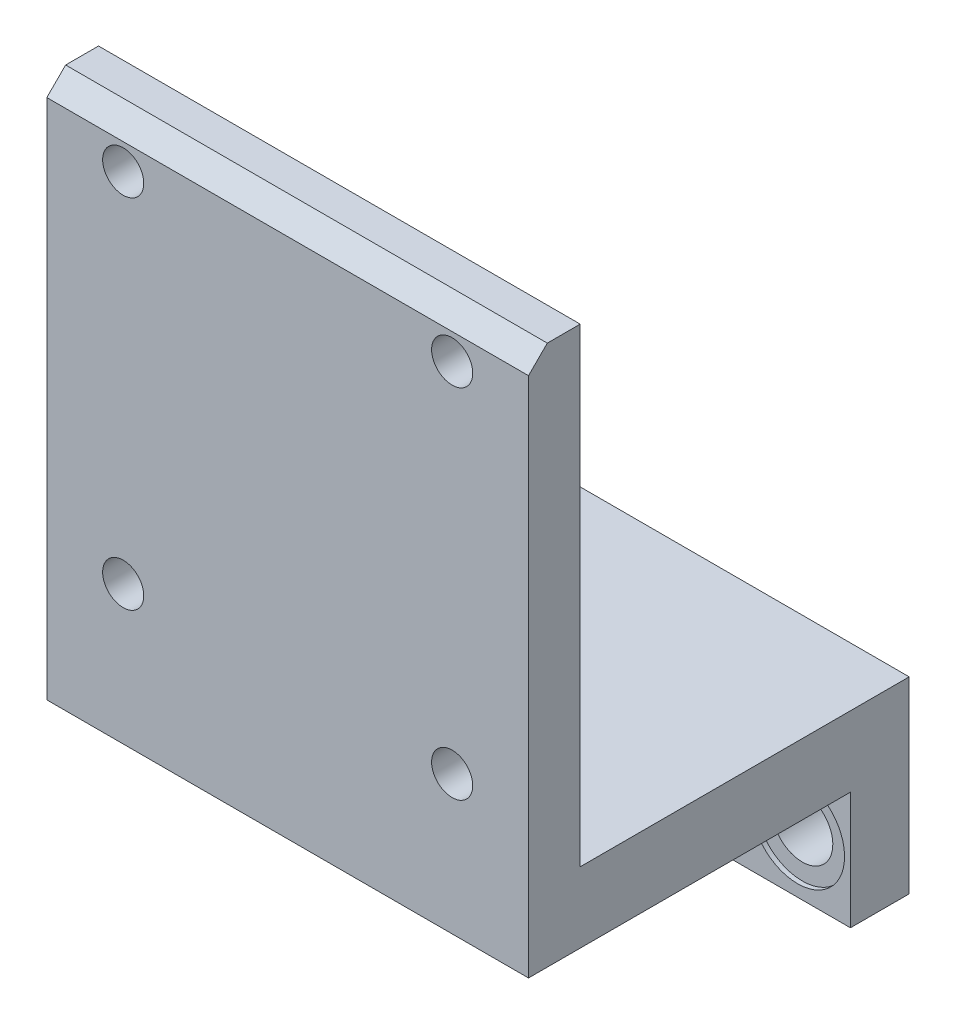
ISO-10303-21;
HEADER;
FILE_DESCRIPTION(('STEP AP214'),'2;1');
FILE_NAME('part.step','',(''),(''),'','','');
FILE_SCHEMA(('AUTOMOTIVE_DESIGN { 1 0 10303 214 1 1 1 1 }'));
ENDSEC;
DATA;
#1=APPLICATION_CONTEXT('core data for automotive mechanical design processes');
#2=APPLICATION_PROTOCOL_DEFINITION('international standard','automotive_design',2000,#1);
#3=PRODUCT_CONTEXT('',#1,'mechanical');
#4=PRODUCT('Part','Part','',(#3));
#5=PRODUCT_RELATED_PRODUCT_CATEGORY('part','',(#4));
#6=PRODUCT_DEFINITION_FORMATION('','',#4);
#7=PRODUCT_DEFINITION_CONTEXT('part definition',#1,'design');
#8=PRODUCT_DEFINITION('design','',#6,#7);
#9=PRODUCT_DEFINITION_SHAPE('','',#8);
#10=(LENGTH_UNIT() NAMED_UNIT(*) SI_UNIT(.MILLI.,.METRE.));
#11=(NAMED_UNIT(*) PLANE_ANGLE_UNIT() SI_UNIT($,.RADIAN.));
#12=(NAMED_UNIT(*) SI_UNIT($,.STERADIAN.) SOLID_ANGLE_UNIT());
#13=UNCERTAINTY_MEASURE_WITH_UNIT(LENGTH_MEASURE(1.E-05),#10,'distance_accuracy_value','');
#14=(GEOMETRIC_REPRESENTATION_CONTEXT(3) GLOBAL_UNCERTAINTY_ASSIGNED_CONTEXT((#13)) GLOBAL_UNIT_ASSIGNED_CONTEXT((#10,
#11,#12)) REPRESENTATION_CONTEXT('',''));
#15=CARTESIAN_POINT('',(0.,0.,0.));
#16=DIRECTION('',(0.,0.,1.));
#17=DIRECTION('',(1.,0.,0.));
#18=AXIS2_PLACEMENT_3D('',#15,#16,#17);
#19=CARTESIAN_POINT('',(205.,230.,0.));
#20=DIRECTION('',(0.,0.,-1.));
#21=DIRECTION('',(0.,1.,0.));
#22=AXIS2_PLACEMENT_3D('',#19,#20,#21);
#23=PLANE('',#22);
#24=CARTESIAN_POINT('',(172.5,59.,0.));
#25=DIRECTION('',(0.,0.,1.));
#26=DIRECTION('',(0.,-1.,0.));
#27=AXIS2_PLACEMENT_3D('',#24,#25,#26);
#28=CIRCLE('',#27,8.74999999999998);
#29=CARTESIAN_POINT('',(172.5,50.25,0.));
#30=VERTEX_POINT('',#29);
#31=EDGE_CURVE('E196',#30,#30,#28,.T.);
#32=ORIENTED_EDGE('',*,*,#31,.F.);
#33=EDGE_LOOP('',(#32));
#34=FACE_BOUND('',#33,.T.);
#35=CARTESIAN_POINT('',(172.5,211.,0.));
#36=DIRECTION('',(0.,0.,1.));
#37=DIRECTION('',(0.,-1.,0.));
#38=AXIS2_PLACEMENT_3D('',#35,#36,#37);
#39=CIRCLE('',#38,8.74999999999998);
#40=CARTESIAN_POINT('',(172.5,202.25,0.));
#41=VERTEX_POINT('',#40);
#42=EDGE_CURVE('E190',#41,#41,#39,.T.);
#43=ORIENTED_EDGE('',*,*,#42,.F.);
#44=EDGE_LOOP('',(#43));
#45=FACE_BOUND('',#44,.T.);
#46=CARTESIAN_POINT('',(32.5,59.,0.));
#47=DIRECTION('',(0.,0.,1.));
#48=DIRECTION('',(0.,-1.,0.));
#49=AXIS2_PLACEMENT_3D('',#46,#47,#48);
#50=CIRCLE('',#49,8.74999999999999);
#51=CARTESIAN_POINT('',(32.5,50.25,0.));
#52=VERTEX_POINT('',#51);
#53=EDGE_CURVE('E184',#52,#52,#50,.T.);
#54=ORIENTED_EDGE('',*,*,#53,.F.);
#55=EDGE_LOOP('',(#54));
#56=FACE_BOUND('',#55,.T.);
#57=CARTESIAN_POINT('',(32.5,211.,0.));
#58=DIRECTION('',(0.,0.,1.));
#59=DIRECTION('',(0.,-1.,0.));
#60=AXIS2_PLACEMENT_3D('',#57,#58,#59);
#61=CIRCLE('',#60,8.74999999999999);
#62=CARTESIAN_POINT('',(32.5,202.25,0.));
#63=VERTEX_POINT('',#62);
#64=EDGE_CURVE('E178',#63,#63,#61,.T.);
#65=ORIENTED_EDGE('',*,*,#64,.F.);
#66=EDGE_LOOP('',(#65));
#67=FACE_BOUND('',#66,.T.);
#68=DIRECTION('',(0.,-1.,0.));
#69=VECTOR('',#68,1.);
#70=CARTESIAN_POINT('',(205.,230.,0.));
#71=LINE('',#70,#69);
#72=CARTESIAN_POINT('',(205.,222.,0.));
#73=VERTEX_POINT('',#72);
#74=CARTESIAN_POINT('',(205.,0.,0.));
#75=VERTEX_POINT('',#74);
#76=EDGE_CURVE('E106',#73,#75,#71,.T.);
#77=ORIENTED_EDGE('',*,*,#76,.F.);
#78=DIRECTION('',(-1.,0.,0.));
#79=VECTOR('',#78,1.);
#80=CARTESIAN_POINT('',(205.,222.,0.));
#81=LINE('',#80,#79);
#82=CARTESIAN_POINT('',(0.,222.,0.));
#83=VERTEX_POINT('',#82);
#84=EDGE_CURVE('E129',#73,#83,#81,.T.);
#85=ORIENTED_EDGE('',*,*,#84,.T.);
#86=DIRECTION('',(0.,-1.,0.));
#87=VECTOR('',#86,1.);
#88=CARTESIAN_POINT('',(0.,230.,0.));
#89=LINE('',#88,#87);
#90=CARTESIAN_POINT('',(0.,0.,0.));
#91=VERTEX_POINT('',#90);
#92=EDGE_CURVE('E127',#83,#91,#89,.T.);
#93=ORIENTED_EDGE('',*,*,#92,.T.);
#94=DIRECTION('',(-1.,0.,0.));
#95=VECTOR('',#94,1.);
#96=CARTESIAN_POINT('',(205.,0.,0.));
#97=LINE('',#96,#95);
#98=EDGE_CURVE('E121',#75,#91,#97,.T.);
#99=ORIENTED_EDGE('',*,*,#98,.F.);
#100=EDGE_LOOP('',(#77,#85,#93,#99));
#101=FACE_BOUND('',#100,.T.);
#102=ADVANCED_FACE('F36',(#34,#45,#56,#67,#101),#23,.F.);
#103=CARTESIAN_POINT('',(205.,0.,0.));
#104=DIRECTION('',(0.,1.,0.));
#105=DIRECTION('',(0.,0.,1.));
#106=AXIS2_PLACEMENT_3D('',#103,#104,#105);
#107=PLANE('',#106);
#108=DIRECTION('',(0.,0.,-1.));
#109=VECTOR('',#108,1.);
#110=CARTESIAN_POINT('',(0.,0.,0.));
#111=LINE('',#110,#109);
#112=CARTESIAN_POINT('',(0.,0.,-137.));
#113=VERTEX_POINT('',#112);
#114=EDGE_CURVE('E162',#91,#113,#111,.T.);
#115=ORIENTED_EDGE('',*,*,#114,.T.);
#116=DIRECTION('',(-1.,0.,0.));
#117=VECTOR('',#116,1.);
#118=CARTESIAN_POINT('',(205.,0.,-137.));
#119=LINE('',#118,#117);
#120=CARTESIAN_POINT('',(205.,0.,-137.));
#121=VERTEX_POINT('',#120);
#122=EDGE_CURVE('E123',#121,#113,#119,.T.);
#123=ORIENTED_EDGE('',*,*,#122,.F.);
#124=DIRECTION('',(0.,0.,-1.));
#125=VECTOR('',#124,1.);
#126=CARTESIAN_POINT('',(205.,0.,0.));
#127=LINE('',#126,#125);
#128=EDGE_CURVE('E109',#75,#121,#127,.T.);
#129=ORIENTED_EDGE('',*,*,#128,.F.);
#130=ORIENTED_EDGE('',*,*,#98,.T.);
#131=EDGE_LOOP('',(#115,#123,#129,#130));
#132=FACE_BOUND('',#131,.T.);
#133=ADVANCED_FACE('F120',(#132),#107,.F.);
#134=CARTESIAN_POINT('',(205.,0.,-137.));
#135=DIRECTION('',(0.,0.,-1.));
#136=DIRECTION('',(0.,1.,0.));
#137=AXIS2_PLACEMENT_3D('',#134,#135,#136);
#138=PLANE('',#137);
#139=CARTESIAN_POINT('',(182.5,-25.,-137.));
#140=DIRECTION('',(0.,0.,1.));
#141=DIRECTION('',(0.,-1.,0.));
#142=AXIS2_PLACEMENT_3D('',#139,#140,#141);
#143=CIRCLE('',#142,20.);
#144=CARTESIAN_POINT('',(182.5,-45.,-137.));
#145=VERTEX_POINT('',#144);
#146=EDGE_CURVE('E232',#145,#145,#143,.T.);
#147=ORIENTED_EDGE('',*,*,#146,.F.);
#148=EDGE_LOOP('',(#147));
#149=FACE_BOUND('',#148,.T.);
#150=CARTESIAN_POINT('',(102.5,-25.,-137.));
#151=DIRECTION('',(0.,0.,1.));
#152=DIRECTION('',(0.,-1.,0.));
#153=AXIS2_PLACEMENT_3D('',#150,#151,#152);
#154=CIRCLE('',#153,20.);
#155=CARTESIAN_POINT('',(102.5,-45.,-137.));
#156=VERTEX_POINT('',#155);
#157=EDGE_CURVE('E220',#156,#156,#154,.T.);
#158=ORIENTED_EDGE('',*,*,#157,.F.);
#159=EDGE_LOOP('',(#158));
#160=FACE_BOUND('',#159,.T.);
#161=CARTESIAN_POINT('',(22.5,-25.,-137.));
#162=DIRECTION('',(0.,0.,1.));
#163=DIRECTION('',(0.,-1.,0.));
#164=AXIS2_PLACEMENT_3D('',#161,#162,#163);
#165=CIRCLE('',#164,20.);
#166=CARTESIAN_POINT('',(22.5,-45.,-137.));
#167=VERTEX_POINT('',#166);
#168=EDGE_CURVE('E208',#167,#167,#165,.T.);
#169=ORIENTED_EDGE('',*,*,#168,.F.);
#170=EDGE_LOOP('',(#169));
#171=FACE_BOUND('',#170,.T.);
#172=DIRECTION('',(0.,-1.,0.));
#173=VECTOR('',#172,1.);
#174=CARTESIAN_POINT('',(0.,0.,-137.));
#175=LINE('',#174,#173);
#176=CARTESIAN_POINT('',(0.,-50.,-137.));
#177=VERTEX_POINT('',#176);
#178=EDGE_CURVE('E160',#113,#177,#175,.T.);
#179=ORIENTED_EDGE('',*,*,#178,.T.);
#180=DIRECTION('',(-1.,0.,0.));
#181=VECTOR('',#180,1.);
#182=CARTESIAN_POINT('',(205.,-50.,-137.));
#183=LINE('',#182,#181);
#184=CARTESIAN_POINT('',(205.,-50.,-137.));
#185=VERTEX_POINT('',#184);
#186=EDGE_CURVE('E132',#185,#177,#183,.T.);
#187=ORIENTED_EDGE('',*,*,#186,.F.);
#188=DIRECTION('',(0.,-1.,0.));
#189=VECTOR('',#188,1.);
#190=CARTESIAN_POINT('',(205.,0.,-137.));
#191=LINE('',#190,#189);
#192=EDGE_CURVE('E125',#121,#185,#191,.T.);
#193=ORIENTED_EDGE('',*,*,#192,.F.);
#194=ORIENTED_EDGE('',*,*,#122,.T.);
#195=EDGE_LOOP('',(#179,#187,#193,#194));
#196=FACE_BOUND('',#195,.T.);
#197=ADVANCED_FACE('F238',(#149,#160,#171,#196),#138,.F.);
#198=CARTESIAN_POINT('',(205.,-50.,-137.));
#199=DIRECTION('',(0.,1.,0.));
#200=DIRECTION('',(0.,0.,1.));
#201=AXIS2_PLACEMENT_3D('',#198,#199,#200);
#202=PLANE('',#201);
#203=DIRECTION('',(0.,0.,-1.));
#204=VECTOR('',#203,1.);
#205=CARTESIAN_POINT('',(0.,-50.,-137.));
#206=LINE('',#205,#204);
#207=CARTESIAN_POINT('',(0.,-50.,-162.));
#208=VERTEX_POINT('',#207);
#209=EDGE_CURVE('E158',#177,#208,#206,.T.);
#210=ORIENTED_EDGE('',*,*,#209,.T.);
#211=DIRECTION('',(-1.,0.,0.));
#212=VECTOR('',#211,1.);
#213=CARTESIAN_POINT('',(205.,-50.,-162.));
#214=LINE('',#213,#212);
#215=CARTESIAN_POINT('',(205.,-50.,-162.));
#216=VERTEX_POINT('',#215);
#217=EDGE_CURVE('E138',#216,#208,#214,.T.);
#218=ORIENTED_EDGE('',*,*,#217,.F.);
#219=DIRECTION('',(0.,0.,-1.));
#220=VECTOR('',#219,1.);
#221=CARTESIAN_POINT('',(205.,-50.,-137.));
#222=LINE('',#221,#220);
#223=EDGE_CURVE('E173',#185,#216,#222,.T.);
#224=ORIENTED_EDGE('',*,*,#223,.F.);
#225=ORIENTED_EDGE('',*,*,#186,.T.);
#226=EDGE_LOOP('',(#210,#218,#224,#225));
#227=FACE_BOUND('',#226,.T.);
#228=ADVANCED_FACE('F241',(#227),#202,.F.);
#229=CARTESIAN_POINT('',(205.,-50.,-162.));
#230=DIRECTION('',(0.,0.,1.));
#231=DIRECTION('',(1.,0.,0.));
#232=AXIS2_PLACEMENT_3D('',#229,#230,#231);
#233=PLANE('',#232);
#234=CARTESIAN_POINT('',(182.5,-25.,-162.));
#235=DIRECTION('',(0.,0.,1.));
#236=DIRECTION('',(1.,0.,0.));
#237=AXIS2_PLACEMENT_3D('',#234,#235,#236);
#238=CIRCLE('',#237,13.);
#239=CARTESIAN_POINT('',(195.5,-25.,-162.));
#240=VERTEX_POINT('',#239);
#241=EDGE_CURVE('E223',#240,#240,#238,.T.);
#242=ORIENTED_EDGE('',*,*,#241,.T.);
#243=EDGE_LOOP('',(#242));
#244=FACE_BOUND('',#243,.T.);
#245=CARTESIAN_POINT('',(102.5,-25.,-162.));
#246=DIRECTION('',(0.,0.,1.));
#247=DIRECTION('',(1.,0.,0.));
#248=AXIS2_PLACEMENT_3D('',#245,#246,#247);
#249=CIRCLE('',#248,13.);
#250=CARTESIAN_POINT('',(115.5,-25.,-162.));
#251=VERTEX_POINT('',#250);
#252=EDGE_CURVE('E211',#251,#251,#249,.T.);
#253=ORIENTED_EDGE('',*,*,#252,.T.);
#254=EDGE_LOOP('',(#253));
#255=FACE_BOUND('',#254,.T.);
#256=CARTESIAN_POINT('',(22.5,-25.,-162.));
#257=DIRECTION('',(0.,0.,1.));
#258=DIRECTION('',(1.,0.,0.));
#259=AXIS2_PLACEMENT_3D('',#256,#257,#258);
#260=CIRCLE('',#259,13.);
#261=CARTESIAN_POINT('',(35.5,-25.,-162.));
#262=VERTEX_POINT('',#261);
#263=EDGE_CURVE('E199',#262,#262,#260,.T.);
#264=ORIENTED_EDGE('',*,*,#263,.T.);
#265=EDGE_LOOP('',(#264));
#266=FACE_BOUND('',#265,.T.);
#267=DIRECTION('',(0.,1.,0.));
#268=VECTOR('',#267,1.);
#269=CARTESIAN_POINT('',(0.,-50.,-162.));
#270=LINE('',#269,#268);
#271=CARTESIAN_POINT('',(0.,30.,-162.));
#272=VERTEX_POINT('',#271);
#273=EDGE_CURVE('E156',#208,#272,#270,.T.);
#274=ORIENTED_EDGE('',*,*,#273,.T.);
#275=DIRECTION('',(-1.,0.,0.));
#276=VECTOR('',#275,1.);
#277=CARTESIAN_POINT('',(205.,30.,-162.));
#278=LINE('',#277,#276);
#279=CARTESIAN_POINT('',(205.,30.,-162.));
#280=VERTEX_POINT('',#279);
#281=EDGE_CURVE('E141',#280,#272,#278,.T.);
#282=ORIENTED_EDGE('',*,*,#281,.F.);
#283=DIRECTION('',(0.,1.,0.));
#284=VECTOR('',#283,1.);
#285=CARTESIAN_POINT('',(205.,-50.,-162.));
#286=LINE('',#285,#284);
#287=EDGE_CURVE('E171',#216,#280,#286,.T.);
#288=ORIENTED_EDGE('',*,*,#287,.F.);
#289=ORIENTED_EDGE('',*,*,#217,.T.);
#290=EDGE_LOOP('',(#274,#282,#288,#289));
#291=FACE_BOUND('',#290,.T.);
#292=ADVANCED_FACE('F259',(#244,#255,#266,#291),#233,.F.);
#293=CARTESIAN_POINT('',(205.,30.,-162.));
#294=DIRECTION('',(0.,-1.,0.));
#295=DIRECTION('',(0.,0.,-1.));
#296=AXIS2_PLACEMENT_3D('',#293,#294,#295);
#297=PLANE('',#296);
#298=DIRECTION('',(0.,0.,1.));
#299=VECTOR('',#298,1.);
#300=CARTESIAN_POINT('',(0.,30.,-162.));
#301=LINE('',#300,#299);
#302=CARTESIAN_POINT('',(0.,30.,-22.));
#303=VERTEX_POINT('',#302);
#304=EDGE_CURVE('E154',#272,#303,#301,.T.);
#305=ORIENTED_EDGE('',*,*,#304,.T.);
#306=DIRECTION('',(-1.,0.,0.));
#307=VECTOR('',#306,1.);
#308=CARTESIAN_POINT('',(205.,30.,-22.));
#309=LINE('',#308,#307);
#310=CARTESIAN_POINT('',(205.,30.,-22.));
#311=VERTEX_POINT('',#310);
#312=EDGE_CURVE('E144',#311,#303,#309,.T.);
#313=ORIENTED_EDGE('',*,*,#312,.F.);
#314=DIRECTION('',(0.,0.,1.));
#315=VECTOR('',#314,1.);
#316=CARTESIAN_POINT('',(205.,30.,-162.));
#317=LINE('',#316,#315);
#318=EDGE_CURVE('E169',#280,#311,#317,.T.);
#319=ORIENTED_EDGE('',*,*,#318,.F.);
#320=ORIENTED_EDGE('',*,*,#281,.T.);
#321=EDGE_LOOP('',(#305,#313,#319,#320));
#322=FACE_BOUND('',#321,.T.);
#323=ADVANCED_FACE('F263',(#322),#297,.F.);
#324=CARTESIAN_POINT('',(205.,30.,-22.));
#325=DIRECTION('',(0.,0.,1.));
#326=DIRECTION('',(1.,0.,0.));
#327=AXIS2_PLACEMENT_3D('',#324,#325,#326);
#328=PLANE('',#327);
#329=CARTESIAN_POINT('',(172.5,59.,-22.));
#330=DIRECTION('',(0.,0.,1.));
#331=DIRECTION('',(1.,0.,0.));
#332=AXIS2_PLACEMENT_3D('',#329,#330,#331);
#333=CIRCLE('',#332,8.74999999999999);
#334=CARTESIAN_POINT('',(181.25,59.,-22.));
#335=VERTEX_POINT('',#334);
#336=EDGE_CURVE('E193',#335,#335,#333,.T.);
#337=ORIENTED_EDGE('',*,*,#336,.T.);
#338=EDGE_LOOP('',(#337));
#339=FACE_BOUND('',#338,.T.);
#340=CARTESIAN_POINT('',(172.5,211.,-22.));
#341=DIRECTION('',(0.,0.,1.));
#342=DIRECTION('',(1.,0.,0.));
#343=AXIS2_PLACEMENT_3D('',#340,#341,#342);
#344=CIRCLE('',#343,8.74999999999999);
#345=CARTESIAN_POINT('',(181.25,211.,-22.));
#346=VERTEX_POINT('',#345);
#347=EDGE_CURVE('E187',#346,#346,#344,.T.);
#348=ORIENTED_EDGE('',*,*,#347,.T.);
#349=EDGE_LOOP('',(#348));
#350=FACE_BOUND('',#349,.T.);
#351=CARTESIAN_POINT('',(32.5,59.,-22.));
#352=DIRECTION('',(0.,0.,1.));
#353=DIRECTION('',(1.,0.,0.));
#354=AXIS2_PLACEMENT_3D('',#351,#352,#353);
#355=CIRCLE('',#354,8.74999999999999);
#356=CARTESIAN_POINT('',(41.25,59.,-22.));
#357=VERTEX_POINT('',#356);
#358=EDGE_CURVE('E181',#357,#357,#355,.T.);
#359=ORIENTED_EDGE('',*,*,#358,.T.);
#360=EDGE_LOOP('',(#359));
#361=FACE_BOUND('',#360,.T.);
#362=CARTESIAN_POINT('',(32.5,211.,-22.));
#363=DIRECTION('',(0.,0.,1.));
#364=DIRECTION('',(1.,0.,0.));
#365=AXIS2_PLACEMENT_3D('',#362,#363,#364);
#366=CIRCLE('',#365,8.74999999999999);
#367=CARTESIAN_POINT('',(41.25,211.,-22.));
#368=VERTEX_POINT('',#367);
#369=EDGE_CURVE('E165',#368,#368,#366,.T.);
#370=ORIENTED_EDGE('',*,*,#369,.T.);
#371=EDGE_LOOP('',(#370));
#372=FACE_BOUND('',#371,.T.);
#373=DIRECTION('',(0.,1.,0.));
#374=VECTOR('',#373,1.);
#375=CARTESIAN_POINT('',(0.,30.,-22.));
#376=LINE('',#375,#374);
#377=CARTESIAN_POINT('',(0.,230.,-22.));
#378=VERTEX_POINT('',#377);
#379=EDGE_CURVE('E152',#303,#378,#376,.T.);
#380=ORIENTED_EDGE('',*,*,#379,.T.);
#381=DIRECTION('',(-1.,0.,0.));
#382=VECTOR('',#381,1.);
#383=CARTESIAN_POINT('',(205.,230.,-22.));
#384=LINE('',#383,#382);
#385=CARTESIAN_POINT('',(205.,230.,-22.));
#386=VERTEX_POINT('',#385);
#387=EDGE_CURVE('E147',#386,#378,#384,.T.);
#388=ORIENTED_EDGE('',*,*,#387,.F.);
#389=DIRECTION('',(0.,1.,0.));
#390=VECTOR('',#389,1.);
#391=CARTESIAN_POINT('',(205.,30.,-22.));
#392=LINE('',#391,#390);
#393=EDGE_CURVE('E167',#311,#386,#392,.T.);
#394=ORIENTED_EDGE('',*,*,#393,.F.);
#395=ORIENTED_EDGE('',*,*,#312,.T.);
#396=EDGE_LOOP('',(#380,#388,#394,#395));
#397=FACE_BOUND('',#396,.T.);
#398=ADVANCED_FACE('F268',(#339,#350,#361,#372,#397),#328,.F.);
#399=CARTESIAN_POINT('',(205.,230.,-22.));
#400=DIRECTION('',(0.,-1.,0.));
#401=DIRECTION('',(0.,0.,-1.));
#402=AXIS2_PLACEMENT_3D('',#399,#400,#401);
#403=PLANE('',#402);
#404=DIRECTION('',(0.,0.,1.));
#405=VECTOR('',#404,1.);
#406=CARTESIAN_POINT('',(0.,230.,-22.));
#407=LINE('',#406,#405);
#408=CARTESIAN_POINT('',(0.,230.,-8.));
#409=VERTEX_POINT('',#408);
#410=EDGE_CURVE('E116',#378,#409,#407,.T.);
#411=ORIENTED_EDGE('',*,*,#410,.T.);
#412=DIRECTION('',(1.,0.,0.));
#413=VECTOR('',#412,1.);
#414=CARTESIAN_POINT('',(205.,230.,-8.));
#415=LINE('',#414,#413);
#416=CARTESIAN_POINT('',(205.,230.,-8.));
#417=VERTEX_POINT('',#416);
#418=EDGE_CURVE('E44',#409,#417,#415,.T.);
#419=ORIENTED_EDGE('',*,*,#418,.T.);
#420=DIRECTION('',(0.,0.,1.));
#421=VECTOR('',#420,1.);
#422=CARTESIAN_POINT('',(205.,230.,-22.));
#423=LINE('',#422,#421);
#424=EDGE_CURVE('E150',#386,#417,#423,.T.);
#425=ORIENTED_EDGE('',*,*,#424,.F.);
#426=ORIENTED_EDGE('',*,*,#387,.T.);
#427=EDGE_LOOP('',(#411,#419,#425,#426));
#428=FACE_BOUND('',#427,.T.);
#429=ADVANCED_FACE('F269',(#428),#403,.F.);
#430=CARTESIAN_POINT('',(205.,0.,0.));
#431=DIRECTION('',(1.,0.,0.));
#432=DIRECTION('',(0.,0.,-1.));
#433=AXIS2_PLACEMENT_3D('',#430,#431,#432);
#434=PLANE('',#433);
#435=ORIENTED_EDGE('',*,*,#424,.T.);
#436=DIRECTION('',(0.,0.707106781186548,-0.707106781186547));
#437=VECTOR('',#436,1.);
#438=CARTESIAN_POINT('',(205.,111.,111.));
#439=LINE('',#438,#437);
#440=EDGE_CURVE('E11',#417,#73,#439,.F.);
#441=ORIENTED_EDGE('',*,*,#440,.T.);
#442=ORIENTED_EDGE('',*,*,#76,.T.);
#443=ORIENTED_EDGE('',*,*,#128,.T.);
#444=ORIENTED_EDGE('',*,*,#192,.T.);
#445=ORIENTED_EDGE('',*,*,#223,.T.);
#446=ORIENTED_EDGE('',*,*,#287,.T.);
#447=ORIENTED_EDGE('',*,*,#318,.T.);
#448=ORIENTED_EDGE('',*,*,#393,.T.);
#449=EDGE_LOOP('',(#435,#441,#442,#443,#444,#445,#446,#447,#448));
#450=FACE_BOUND('',#449,.T.);
#451=ADVANCED_FACE('F108',(#450),#434,.T.);
#452=CARTESIAN_POINT('',(0.,0.,0.));
#453=DIRECTION('',(1.,0.,0.));
#454=DIRECTION('',(0.,0.,-1.));
#455=AXIS2_PLACEMENT_3D('',#452,#453,#454);
#456=PLANE('',#455);
#457=ORIENTED_EDGE('',*,*,#92,.F.);
#458=DIRECTION('',(0.,-0.707106781186548,0.707106781186547));
#459=VECTOR('',#458,1.);
#460=CARTESIAN_POINT('',(0.,222.,0.));
#461=LINE('',#460,#459);
#462=EDGE_CURVE('E58',#83,#409,#461,.F.);
#463=ORIENTED_EDGE('',*,*,#462,.T.);
#464=ORIENTED_EDGE('',*,*,#410,.F.);
#465=ORIENTED_EDGE('',*,*,#379,.F.);
#466=ORIENTED_EDGE('',*,*,#304,.F.);
#467=ORIENTED_EDGE('',*,*,#273,.F.);
#468=ORIENTED_EDGE('',*,*,#209,.F.);
#469=ORIENTED_EDGE('',*,*,#178,.F.);
#470=ORIENTED_EDGE('',*,*,#114,.F.);
#471=EDGE_LOOP('',(#457,#463,#464,#465,#466,#467,#468,#469,#470));
#472=FACE_BOUND('',#471,.T.);
#473=ADVANCED_FACE('F254',(#472),#456,.F.);
#474=CARTESIAN_POINT('',(32.5,211.,0.));
#475=DIRECTION('',(0.,0.,1.));
#476=DIRECTION('',(0.,-1.,0.));
#477=AXIS2_PLACEMENT_3D('',#474,#475,#476);
#478=CYLINDRICAL_SURFACE('',#477,8.74999999999999);
#479=ORIENTED_EDGE('',*,*,#369,.F.);
#480=EDGE_LOOP('',(#479));
#481=FACE_BOUND('',#480,.T.);
#482=ORIENTED_EDGE('',*,*,#64,.T.);
#483=EDGE_LOOP('',(#482));
#484=FACE_BOUND('',#483,.T.);
#485=ADVANCED_FACE('F324',(#481,#484),#478,.F.);
#486=CARTESIAN_POINT('',(32.5,59.,0.));
#487=DIRECTION('',(0.,0.,1.));
#488=DIRECTION('',(0.,-1.,0.));
#489=AXIS2_PLACEMENT_3D('',#486,#487,#488);
#490=CYLINDRICAL_SURFACE('',#489,8.74999999999999);
#491=ORIENTED_EDGE('',*,*,#358,.F.);
#492=EDGE_LOOP('',(#491));
#493=FACE_BOUND('',#492,.T.);
#494=ORIENTED_EDGE('',*,*,#53,.T.);
#495=EDGE_LOOP('',(#494));
#496=FACE_BOUND('',#495,.T.);
#497=ADVANCED_FACE('F333',(#493,#496),#490,.F.);
#498=CARTESIAN_POINT('',(172.5,211.,0.));
#499=DIRECTION('',(0.,0.,1.));
#500=DIRECTION('',(0.,-1.,0.));
#501=AXIS2_PLACEMENT_3D('',#498,#499,#500);
#502=CYLINDRICAL_SURFACE('',#501,8.74999999999999);
#503=ORIENTED_EDGE('',*,*,#347,.F.);
#504=EDGE_LOOP('',(#503));
#505=FACE_BOUND('',#504,.T.);
#506=ORIENTED_EDGE('',*,*,#42,.T.);
#507=EDGE_LOOP('',(#506));
#508=FACE_BOUND('',#507,.T.);
#509=ADVANCED_FACE('F340',(#505,#508),#502,.F.);
#510=CARTESIAN_POINT('',(172.5,59.,0.));
#511=DIRECTION('',(0.,0.,1.));
#512=DIRECTION('',(0.,-1.,0.));
#513=AXIS2_PLACEMENT_3D('',#510,#511,#512);
#514=CYLINDRICAL_SURFACE('',#513,8.74999999999999);
#515=ORIENTED_EDGE('',*,*,#336,.F.);
#516=EDGE_LOOP('',(#515));
#517=FACE_BOUND('',#516,.T.);
#518=ORIENTED_EDGE('',*,*,#31,.T.);
#519=EDGE_LOOP('',(#518));
#520=FACE_BOUND('',#519,.T.);
#521=ADVANCED_FACE('F349',(#517,#520),#514,.F.);
#522=CARTESIAN_POINT('',(22.5,-25.,-137.));
#523=DIRECTION('',(0.,0.,1.));
#524=DIRECTION('',(0.,-1.,0.));
#525=AXIS2_PLACEMENT_3D('',#522,#523,#524);
#526=CYLINDRICAL_SURFACE('',#525,13.);
#527=ORIENTED_EDGE('',*,*,#263,.F.);
#528=EDGE_LOOP('',(#527));
#529=FACE_BOUND('',#528,.T.);
#530=CARTESIAN_POINT('',(22.5,-25.,-139.));
#531=DIRECTION('',(0.,0.,1.));
#532=DIRECTION('',(0.,-1.,0.));
#533=AXIS2_PLACEMENT_3D('',#530,#531,#532);
#534=CIRCLE('',#533,13.);
#535=CARTESIAN_POINT('',(22.5,-38.,-139.));
#536=VERTEX_POINT('',#535);
#537=EDGE_CURVE('E202',#536,#536,#534,.T.);
#538=ORIENTED_EDGE('',*,*,#537,.T.);
#539=EDGE_LOOP('',(#538));
#540=FACE_BOUND('',#539,.T.);
#541=ADVANCED_FACE('F358',(#529,#540),#526,.F.);
#542=CARTESIAN_POINT('',(35.5,-25.,-139.));
#543=DIRECTION('',(0.,0.,-1.));
#544=DIRECTION('',(0.,1.,0.));
#545=AXIS2_PLACEMENT_3D('',#542,#543,#544);
#546=PLANE('',#545);
#547=ORIENTED_EDGE('',*,*,#537,.F.);
#548=EDGE_LOOP('',(#547));
#549=FACE_BOUND('',#548,.T.);
#550=CARTESIAN_POINT('',(22.5,-25.,-139.));
#551=DIRECTION('',(0.,0.,1.));
#552=DIRECTION('',(0.,-1.,0.));
#553=AXIS2_PLACEMENT_3D('',#550,#551,#552);
#554=CIRCLE('',#553,20.);
#555=CARTESIAN_POINT('',(22.5,-45.,-139.));
#556=VERTEX_POINT('',#555);
#557=EDGE_CURVE('E205',#556,#556,#554,.T.);
#558=ORIENTED_EDGE('',*,*,#557,.T.);
#559=EDGE_LOOP('',(#558));
#560=FACE_BOUND('',#559,.T.);
#561=ADVANCED_FACE('F365',(#549,#560),#546,.F.);
#562=CARTESIAN_POINT('',(22.5,-25.,-137.));
#563=DIRECTION('',(0.,0.,1.));
#564=DIRECTION('',(0.,-1.,0.));
#565=AXIS2_PLACEMENT_3D('',#562,#563,#564);
#566=CYLINDRICAL_SURFACE('',#565,20.);
#567=ORIENTED_EDGE('',*,*,#557,.F.);
#568=EDGE_LOOP('',(#567));
#569=FACE_BOUND('',#568,.T.);
#570=ORIENTED_EDGE('',*,*,#168,.T.);
#571=EDGE_LOOP('',(#570));
#572=FACE_BOUND('',#571,.T.);
#573=ADVANCED_FACE('F373',(#569,#572),#566,.F.);
#574=CARTESIAN_POINT('',(102.5,-25.,-137.));
#575=DIRECTION('',(0.,0.,1.));
#576=DIRECTION('',(0.,-1.,0.));
#577=AXIS2_PLACEMENT_3D('',#574,#575,#576);
#578=CYLINDRICAL_SURFACE('',#577,13.);
#579=ORIENTED_EDGE('',*,*,#252,.F.);
#580=EDGE_LOOP('',(#579));
#581=FACE_BOUND('',#580,.T.);
#582=CARTESIAN_POINT('',(102.5,-25.,-139.));
#583=DIRECTION('',(0.,0.,1.));
#584=DIRECTION('',(0.,-1.,0.));
#585=AXIS2_PLACEMENT_3D('',#582,#583,#584);
#586=CIRCLE('',#585,13.);
#587=CARTESIAN_POINT('',(102.5,-38.,-139.));
#588=VERTEX_POINT('',#587);
#589=EDGE_CURVE('E214',#588,#588,#586,.T.);
#590=ORIENTED_EDGE('',*,*,#589,.T.);
#591=EDGE_LOOP('',(#590));
#592=FACE_BOUND('',#591,.T.);
#593=ADVANCED_FACE('F381',(#581,#592),#578,.F.);
#594=CARTESIAN_POINT('',(115.5,-25.,-139.));
#595=DIRECTION('',(0.,0.,-1.));
#596=DIRECTION('',(0.,1.,0.));
#597=AXIS2_PLACEMENT_3D('',#594,#595,#596);
#598=PLANE('',#597);
#599=ORIENTED_EDGE('',*,*,#589,.F.);
#600=EDGE_LOOP('',(#599));
#601=FACE_BOUND('',#600,.T.);
#602=CARTESIAN_POINT('',(102.5,-25.,-139.));
#603=DIRECTION('',(0.,0.,1.));
#604=DIRECTION('',(0.,-1.,0.));
#605=AXIS2_PLACEMENT_3D('',#602,#603,#604);
#606=CIRCLE('',#605,20.);
#607=CARTESIAN_POINT('',(102.5,-45.,-139.));
#608=VERTEX_POINT('',#607);
#609=EDGE_CURVE('E217',#608,#608,#606,.T.);
#610=ORIENTED_EDGE('',*,*,#609,.T.);
#611=EDGE_LOOP('',(#610));
#612=FACE_BOUND('',#611,.T.);
#613=ADVANCED_FACE('F390',(#601,#612),#598,.F.);
#614=CARTESIAN_POINT('',(102.5,-25.,-137.));
#615=DIRECTION('',(0.,0.,1.));
#616=DIRECTION('',(0.,-1.,0.));
#617=AXIS2_PLACEMENT_3D('',#614,#615,#616);
#618=CYLINDRICAL_SURFACE('',#617,20.);
#619=ORIENTED_EDGE('',*,*,#609,.F.);
#620=EDGE_LOOP('',(#619));
#621=FACE_BOUND('',#620,.T.);
#622=ORIENTED_EDGE('',*,*,#157,.T.);
#623=EDGE_LOOP('',(#622));
#624=FACE_BOUND('',#623,.T.);
#625=ADVANCED_FACE('F398',(#621,#624),#618,.F.);
#626=CARTESIAN_POINT('',(182.5,-25.,-137.));
#627=DIRECTION('',(0.,0.,1.));
#628=DIRECTION('',(0.,-1.,0.));
#629=AXIS2_PLACEMENT_3D('',#626,#627,#628);
#630=CYLINDRICAL_SURFACE('',#629,13.);
#631=ORIENTED_EDGE('',*,*,#241,.F.);
#632=EDGE_LOOP('',(#631));
#633=FACE_BOUND('',#632,.T.);
#634=CARTESIAN_POINT('',(182.5,-25.,-139.));
#635=DIRECTION('',(0.,0.,1.));
#636=DIRECTION('',(0.,-1.,0.));
#637=AXIS2_PLACEMENT_3D('',#634,#635,#636);
#638=CIRCLE('',#637,13.);
#639=CARTESIAN_POINT('',(182.5,-38.,-139.));
#640=VERTEX_POINT('',#639);
#641=EDGE_CURVE('E226',#640,#640,#638,.T.);
#642=ORIENTED_EDGE('',*,*,#641,.T.);
#643=EDGE_LOOP('',(#642));
#644=FACE_BOUND('',#643,.T.);
#645=ADVANCED_FACE('F406',(#633,#644),#630,.F.);
#646=CARTESIAN_POINT('',(195.5,-25.,-139.));
#647=DIRECTION('',(0.,0.,-1.));
#648=DIRECTION('',(0.,1.,0.));
#649=AXIS2_PLACEMENT_3D('',#646,#647,#648);
#650=PLANE('',#649);
#651=ORIENTED_EDGE('',*,*,#641,.F.);
#652=EDGE_LOOP('',(#651));
#653=FACE_BOUND('',#652,.T.);
#654=CARTESIAN_POINT('',(182.5,-25.,-139.));
#655=DIRECTION('',(0.,0.,1.));
#656=DIRECTION('',(0.,-1.,0.));
#657=AXIS2_PLACEMENT_3D('',#654,#655,#656);
#658=CIRCLE('',#657,20.);
#659=CARTESIAN_POINT('',(182.5,-45.,-139.));
#660=VERTEX_POINT('',#659);
#661=EDGE_CURVE('E229',#660,#660,#658,.T.);
#662=ORIENTED_EDGE('',*,*,#661,.T.);
#663=EDGE_LOOP('',(#662));
#664=FACE_BOUND('',#663,.T.);
#665=ADVANCED_FACE('F414',(#653,#664),#650,.F.);
#666=CARTESIAN_POINT('',(182.5,-25.,-137.));
#667=DIRECTION('',(0.,0.,1.));
#668=DIRECTION('',(0.,-1.,0.));
#669=AXIS2_PLACEMENT_3D('',#666,#667,#668);
#670=CYLINDRICAL_SURFACE('',#669,20.);
#671=ORIENTED_EDGE('',*,*,#661,.F.);
#672=EDGE_LOOP('',(#671));
#673=FACE_BOUND('',#672,.T.);
#674=ORIENTED_EDGE('',*,*,#146,.T.);
#675=EDGE_LOOP('',(#674));
#676=FACE_BOUND('',#675,.T.);
#677=ADVANCED_FACE('F236',(#673,#676),#670,.F.);
#678=CARTESIAN_POINT('',(205.,222.,0.));
#679=DIRECTION('',(0.,-0.707106781186547,-0.707106781186548));
#680=DIRECTION('',(-1.,0.,0.));
#681=AXIS2_PLACEMENT_3D('',#678,#679,#680);
#682=PLANE('',#681);
#683=ORIENTED_EDGE('',*,*,#440,.F.);
#684=ORIENTED_EDGE('',*,*,#418,.F.);
#685=ORIENTED_EDGE('',*,*,#462,.F.);
#686=ORIENTED_EDGE('',*,*,#84,.F.);
#687=EDGE_LOOP('',(#683,#684,#685,#686));
#688=FACE_BOUND('',#687,.T.);
#689=ADVANCED_FACE('F38',(#688),#682,.F.);
#690=CLOSED_SHELL('',(#102,#133,#197,#228,#292,#323,#398,#429,#451,#473,#485,#497,#509,#521,
#541,#561,#573,#593,#613,#625,#645,#665,#677,#689));
#691=MANIFOLD_SOLID_BREP('B2',#690);
#692=ADVANCED_BREP_SHAPE_REPRESENTATION('',(#18,#691),#14);
#693=SHAPE_DEFINITION_REPRESENTATION(#9,#692);
ENDSEC;
END-ISO-10303-21;
